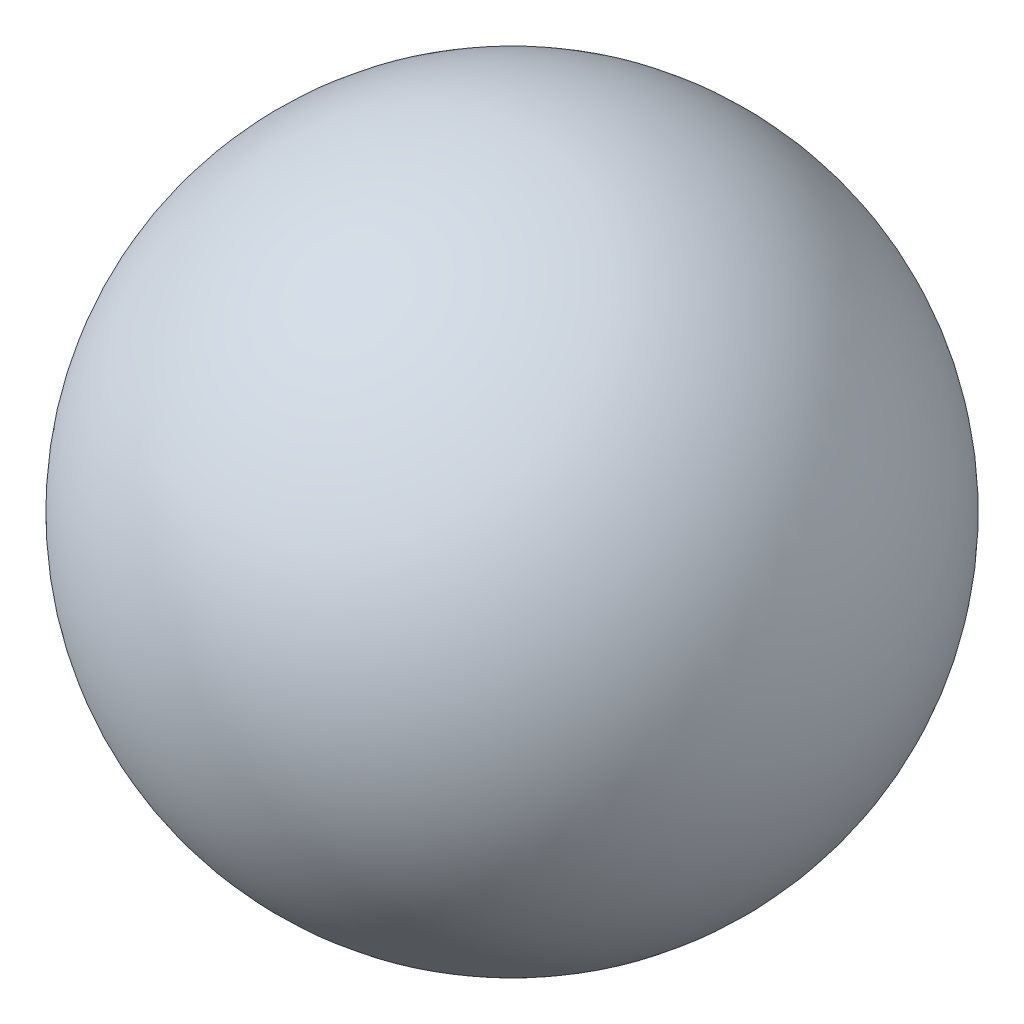
ISO-10303-21;
HEADER;
FILE_DESCRIPTION(('STEP AP214'),'2;1');
FILE_NAME('part.step','',(''),(''),'','','');
FILE_SCHEMA(('AUTOMOTIVE_DESIGN { 1 0 10303 214 1 1 1 1 }'));
ENDSEC;
DATA;
#1=APPLICATION_CONTEXT('core data for automotive mechanical design processes');
#2=APPLICATION_PROTOCOL_DEFINITION('international standard','automotive_design',2000,#1);
#3=PRODUCT_CONTEXT('',#1,'mechanical');
#4=PRODUCT('Part','Part','',(#3));
#5=PRODUCT_RELATED_PRODUCT_CATEGORY('part','',(#4));
#6=PRODUCT_DEFINITION_FORMATION('','',#4);
#7=PRODUCT_DEFINITION_CONTEXT('part definition',#1,'design');
#8=PRODUCT_DEFINITION('design','',#6,#7);
#9=PRODUCT_DEFINITION_SHAPE('','',#8);
#10=(LENGTH_UNIT() NAMED_UNIT(*) SI_UNIT(.MILLI.,.METRE.));
#11=(NAMED_UNIT(*) PLANE_ANGLE_UNIT() SI_UNIT($,.RADIAN.));
#12=(NAMED_UNIT(*) SI_UNIT($,.STERADIAN.) SOLID_ANGLE_UNIT());
#13=UNCERTAINTY_MEASURE_WITH_UNIT(LENGTH_MEASURE(1.E-05),#10,'distance_accuracy_value','');
#14=(GEOMETRIC_REPRESENTATION_CONTEXT(3) GLOBAL_UNCERTAINTY_ASSIGNED_CONTEXT((#13)) GLOBAL_UNIT_ASSIGNED_CONTEXT((#10,
#11,#12)) REPRESENTATION_CONTEXT('',''));
#15=CARTESIAN_POINT('',(0.,0.,0.));
#16=DIRECTION('',(0.,0.,1.));
#17=DIRECTION('',(1.,0.,0.));
#18=AXIS2_PLACEMENT_3D('',#15,#16,#17);
#19=CARTESIAN_POINT('',(0.,0.,0.));
#20=DIRECTION('',(0.,1.,0.));
#21=DIRECTION('',(1.,0.,0.));
#22=AXIS2_PLACEMENT_3D('',#19,#20,#21);
#23=SPHERICAL_SURFACE('',#22,20.32);
#24=CARTESIAN_POINT('',(0.,20.32,0.));
#25=VERTEX_POINT('',#24);
#26=VERTEX_LOOP('',#25);
#27=FACE_BOUND('',#26,.T.);
#28=ADVANCED_FACE('F30',(#27),#23,.T.);
#29=CLOSED_SHELL('',(#28));
#30=MANIFOLD_SOLID_BREP('B2',#29);
#31=ADVANCED_BREP_SHAPE_REPRESENTATION('',(#18,#30),#14);
#32=SHAPE_DEFINITION_REPRESENTATION(#9,#31);
ENDSEC;
END-ISO-10303-21;
